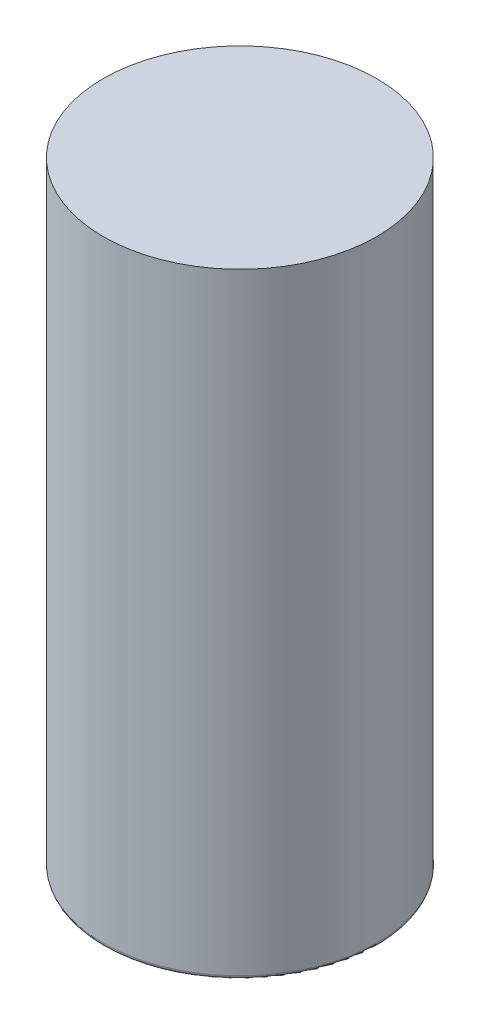
ISO-10303-21;
HEADER;
FILE_DESCRIPTION(('STEP AP214'),'2;1');
FILE_NAME('part.step','',(''),(''),'','','');
FILE_SCHEMA(('AUTOMOTIVE_DESIGN { 1 0 10303 214 1 1 1 1 }'));
ENDSEC;
DATA;
#1=APPLICATION_CONTEXT('core data for automotive mechanical design processes');
#2=APPLICATION_PROTOCOL_DEFINITION('international standard','automotive_design',2000,#1);
#3=PRODUCT_CONTEXT('',#1,'mechanical');
#4=PRODUCT('Part','Part','',(#3));
#5=PRODUCT_RELATED_PRODUCT_CATEGORY('part','',(#4));
#6=PRODUCT_DEFINITION_FORMATION('','',#4);
#7=PRODUCT_DEFINITION_CONTEXT('part definition',#1,'design');
#8=PRODUCT_DEFINITION('design','',#6,#7);
#9=PRODUCT_DEFINITION_SHAPE('','',#8);
#10=(LENGTH_UNIT() NAMED_UNIT(*) SI_UNIT(.MILLI.,.METRE.));
#11=(NAMED_UNIT(*) PLANE_ANGLE_UNIT() SI_UNIT($,.RADIAN.));
#12=(NAMED_UNIT(*) SI_UNIT($,.STERADIAN.) SOLID_ANGLE_UNIT());
#13=UNCERTAINTY_MEASURE_WITH_UNIT(LENGTH_MEASURE(1.E-05),#10,'distance_accuracy_value','');
#14=(GEOMETRIC_REPRESENTATION_CONTEXT(3) GLOBAL_UNCERTAINTY_ASSIGNED_CONTEXT((#13)) GLOBAL_UNIT_ASSIGNED_CONTEXT((#10,
#11,#12)) REPRESENTATION_CONTEXT('',''));
#15=CARTESIAN_POINT('',(0.,0.,0.));
#16=DIRECTION('',(0.,0.,1.));
#17=DIRECTION('',(1.,0.,0.));
#18=AXIS2_PLACEMENT_3D('',#15,#16,#17);
#19=CARTESIAN_POINT('',(0.,40.5,0.));
#20=DIRECTION('',(0.,-1.,0.));
#21=DIRECTION('',(0.,0.,-1.));
#22=AXIS2_PLACEMENT_3D('',#19,#20,#21);
#23=CYLINDRICAL_SURFACE('',#22,9.);
#24=CARTESIAN_POINT('',(0.,0.253999999999997,0.));
#25=DIRECTION('',(0.,1.,0.));
#26=DIRECTION('',(0.,0.,1.));
#27=AXIS2_PLACEMENT_3D('',#24,#25,#26);
#28=CIRCLE('',#27,9.);
#29=CARTESIAN_POINT('',(0.,0.253999999999997,9.));
#30=VERTEX_POINT('',#29);
#31=EDGE_CURVE('E38',#30,#30,#28,.T.);
#32=ORIENTED_EDGE('',*,*,#31,.T.);
#33=EDGE_LOOP('',(#32));
#34=FACE_BOUND('',#33,.T.);
#35=CARTESIAN_POINT('',(0.,40.5,0.));
#36=DIRECTION('',(0.,1.,0.));
#37=DIRECTION('',(0.,0.,1.));
#38=AXIS2_PLACEMENT_3D('',#35,#36,#37);
#39=CIRCLE('',#38,9.);
#40=CARTESIAN_POINT('',(0.,40.5,9.));
#41=VERTEX_POINT('',#40);
#42=EDGE_CURVE('E42',#41,#41,#39,.T.);
#43=ORIENTED_EDGE('',*,*,#42,.F.);
#44=EDGE_LOOP('',(#43));
#45=FACE_BOUND('',#44,.T.);
#46=ADVANCED_FACE('F31',(#34,#45),#23,.T.);
#47=CARTESIAN_POINT('',(0.,40.5,0.));
#48=DIRECTION('',(0.,1.,0.));
#49=DIRECTION('',(0.,0.,1.));
#50=AXIS2_PLACEMENT_3D('',#47,#48,#49);
#51=PLANE('',#50);
#52=ORIENTED_EDGE('',*,*,#42,.T.);
#53=EDGE_LOOP('',(#52));
#54=FACE_BOUND('',#53,.T.);
#55=ADVANCED_FACE('F49',(#54),#51,.T.);
#56=CARTESIAN_POINT('',(0.,0.,0.));
#57=DIRECTION('',(0.,1.,0.));
#58=DIRECTION('',(0.,0.,1.));
#59=AXIS2_PLACEMENT_3D('',#56,#57,#58);
#60=PLANE('',#59);
#61=CARTESIAN_POINT('',(0.,0.,0.));
#62=DIRECTION('',(0.,1.,0.));
#63=DIRECTION('',(0.,0.,1.));
#64=AXIS2_PLACEMENT_3D('',#61,#62,#63);
#65=CIRCLE('',#64,8.746);
#66=CARTESIAN_POINT('',(0.,0.,8.746));
#67=VERTEX_POINT('',#66);
#68=EDGE_CURVE('E10',#67,#67,#65,.F.);
#69=ORIENTED_EDGE('',*,*,#68,.T.);
#70=EDGE_LOOP('',(#69));
#71=FACE_BOUND('',#70,.T.);
#72=ADVANCED_FACE('F57',(#71),#60,.F.);
#73=CARTESIAN_POINT('',(0.,0.253999999999997,0.));
#74=DIRECTION('',(0.,1.,0.));
#75=DIRECTION('',(0.,0.,1.));
#76=AXIS2_PLACEMENT_3D('',#73,#74,#75);
#77=TOROIDAL_SURFACE('',#76,8.746,0.254);
#78=ORIENTED_EDGE('',*,*,#68,.F.);
#79=EDGE_LOOP('',(#78));
#80=FACE_BOUND('',#79,.T.);
#81=ORIENTED_EDGE('',*,*,#31,.F.);
#82=EDGE_LOOP('',(#81));
#83=FACE_BOUND('',#82,.T.);
#84=ADVANCED_FACE('F33',(#80,#83),#77,.T.);
#85=CLOSED_SHELL('',(#46,#55,#72,#84));
#86=MANIFOLD_SOLID_BREP('B2',#85);
#87=ADVANCED_BREP_SHAPE_REPRESENTATION('',(#18,#86),#14);
#88=SHAPE_DEFINITION_REPRESENTATION(#9,#87);
ENDSEC;
END-ISO-10303-21;
